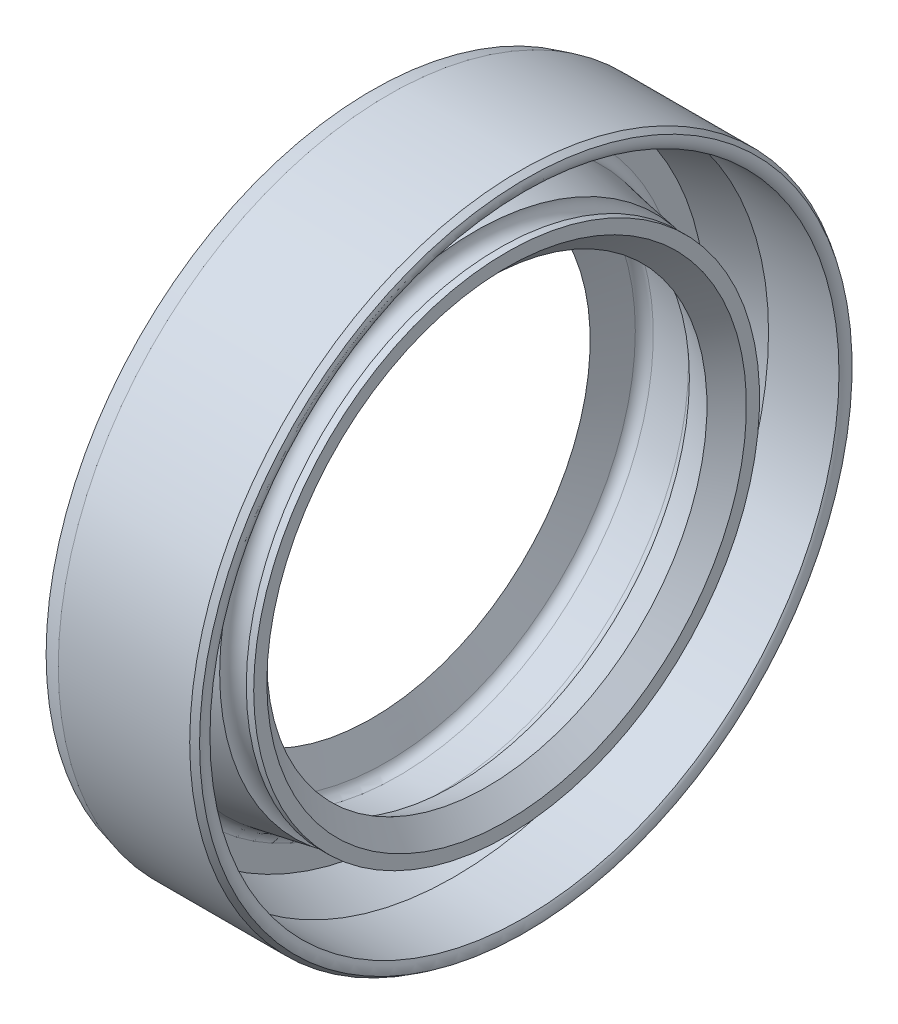
ISO-10303-21;
HEADER;
FILE_DESCRIPTION(('STEP AP214'),'2;1');
FILE_NAME('part.step','',(''),(''),'','','');
FILE_SCHEMA(('AUTOMOTIVE_DESIGN { 1 0 10303 214 1 1 1 1 }'));
ENDSEC;
DATA;
#1=APPLICATION_CONTEXT('core data for automotive mechanical design processes');
#2=APPLICATION_PROTOCOL_DEFINITION('international standard','automotive_design',2000,#1);
#3=PRODUCT_CONTEXT('',#1,'mechanical');
#4=PRODUCT('Part','Part','',(#3));
#5=PRODUCT_RELATED_PRODUCT_CATEGORY('part','',(#4));
#6=PRODUCT_DEFINITION_FORMATION('','',#4);
#7=PRODUCT_DEFINITION_CONTEXT('part definition',#1,'design');
#8=PRODUCT_DEFINITION('design','',#6,#7);
#9=PRODUCT_DEFINITION_SHAPE('','',#8);
#10=(LENGTH_UNIT() NAMED_UNIT(*) SI_UNIT(.MILLI.,.METRE.));
#11=(NAMED_UNIT(*) PLANE_ANGLE_UNIT() SI_UNIT($,.RADIAN.));
#12=(NAMED_UNIT(*) SI_UNIT($,.STERADIAN.) SOLID_ANGLE_UNIT());
#13=UNCERTAINTY_MEASURE_WITH_UNIT(LENGTH_MEASURE(1.E-05),#10,'distance_accuracy_value','');
#14=(GEOMETRIC_REPRESENTATION_CONTEXT(3) GLOBAL_UNCERTAINTY_ASSIGNED_CONTEXT((#13)) GLOBAL_UNIT_ASSIGNED_CONTEXT((#10,
#11,#12)) REPRESENTATION_CONTEXT('',''));
#15=CARTESIAN_POINT('',(0.,0.,0.));
#16=DIRECTION('',(0.,0.,1.));
#17=DIRECTION('',(1.,0.,0.));
#18=AXIS2_PLACEMENT_3D('',#15,#16,#17);
#19=CARTESIAN_POINT('',(-19.4565940720075,0.,0.));
#20=DIRECTION('',(-1.,0.,0.));
#21=DIRECTION('',(0.,0.,1.));
#22=AXIS2_PLACEMENT_3D('',#19,#20,#21);
#23=CYLINDRICAL_SURFACE('',#22,15.);
#24=CARTESIAN_POINT('',(0.752354754295494,0.,0.));
#25=DIRECTION('',(-1.,0.,0.));
#26=DIRECTION('',(0.,0.,1.));
#27=AXIS2_PLACEMENT_3D('',#24,#25,#26);
#28=CIRCLE('',#27,15.);
#29=CARTESIAN_POINT('',(0.752354754295494,0.,15.));
#30=VERTEX_POINT('',#29);
#31=EDGE_CURVE('E93',#30,#30,#28,.T.);
#32=ORIENTED_EDGE('',*,*,#31,.F.);
#33=EDGE_LOOP('',(#32));
#34=FACE_BOUND('',#33,.T.);
#35=CARTESIAN_POINT('',(6.72553980767342,0.,0.));
#36=DIRECTION('',(-1.,0.,0.));
#37=DIRECTION('',(0.,0.,1.));
#38=AXIS2_PLACEMENT_3D('',#35,#36,#37);
#39=CIRCLE('',#38,15.);
#40=CARTESIAN_POINT('',(6.72553980767342,0.,15.));
#41=VERTEX_POINT('',#40);
#42=EDGE_CURVE('E10',#41,#41,#39,.T.);
#43=ORIENTED_EDGE('',*,*,#42,.T.);
#44=EDGE_LOOP('',(#43));
#45=FACE_BOUND('',#44,.T.);
#46=ADVANCED_FACE('F32',(#34,#45),#23,.T.);
#47=CARTESIAN_POINT('',(7.00000000000006,0.,0.));
#48=DIRECTION('',(-1.,0.,0.));
#49=DIRECTION('',(0.,0.,1.));
#50=AXIS2_PLACEMENT_3D('',#47,#48,#49);
#51=CONICAL_SURFACE('',#50,14.826667112104,0.563289195696339);
#52=ORIENTED_EDGE('',*,*,#42,.F.);
#53=EDGE_LOOP('',(#52));
#54=FACE_BOUND('',#53,.T.);
#55=CARTESIAN_POINT('',(7.00000000000006,0.,0.));
#56=DIRECTION('',(-1.,0.,0.));
#57=DIRECTION('',(0.,0.,1.));
#58=AXIS2_PLACEMENT_3D('',#55,#56,#57);
#59=CIRCLE('',#58,14.826667112104);
#60=CARTESIAN_POINT('',(7.00000000000006,0.,14.826667112104));
#61=VERTEX_POINT('',#60);
#62=EDGE_CURVE('E38',#61,#61,#59,.T.);
#63=ORIENTED_EDGE('',*,*,#62,.T.);
#64=EDGE_LOOP('',(#63));
#65=FACE_BOUND('',#64,.T.);
#66=ADVANCED_FACE('F100',(#54,#65),#51,.T.);
#67=CARTESIAN_POINT('',(6.51124728889201,0.,0.));
#68=DIRECTION('',(-1.,0.,0.));
#69=DIRECTION('',(0.,0.,1.));
#70=AXIS2_PLACEMENT_3D('',#67,#68,#69);
#71=TOROIDAL_SURFACE('',#70,14.6121108174778,0.533773000609059);
#72=ORIENTED_EDGE('',*,*,#62,.F.);
#73=EDGE_LOOP('',(#72));
#74=FACE_BOUND('',#73,.T.);
#75=CARTESIAN_POINT('',(6.93904900791708,0.,0.));
#76=DIRECTION('',(-1.,0.,0.));
#77=DIRECTION('',(0.,0.,1.));
#78=AXIS2_PLACEMENT_3D('',#75,#76,#77);
#79=CIRCLE('',#78,14.2928941114951);
#80=CARTESIAN_POINT('',(6.93904900791708,0.,14.2928941114951));
#81=VERTEX_POINT('',#80);
#82=EDGE_CURVE('E42',#81,#81,#79,.T.);
#83=ORIENTED_EDGE('',*,*,#82,.T.);
#84=EDGE_LOOP('',(#83));
#85=FACE_BOUND('',#84,.T.);
#86=ADVANCED_FACE('F104',(#74,#85),#71,.T.);
#87=CARTESIAN_POINT('',(-19.4565940720075,0.,0.));
#88=DIRECTION('',(-1.,0.,0.));
#89=DIRECTION('',(0.,0.,1.));
#90=AXIS2_PLACEMENT_3D('',#87,#88,#89);
#91=CYLINDRICAL_SURFACE('',#90,14.2928941114951);
#92=ORIENTED_EDGE('',*,*,#82,.F.);
#93=EDGE_LOOP('',(#92));
#94=FACE_BOUND('',#93,.T.);
#95=CARTESIAN_POINT('',(3.73641100426317,0.,0.));
#96=DIRECTION('',(-1.,0.,0.));
#97=DIRECTION('',(0.,0.,1.));
#98=AXIS2_PLACEMENT_3D('',#95,#96,#97);
#99=CIRCLE('',#98,14.2928941114952);
#100=CARTESIAN_POINT('',(3.73641100426317,0.,14.2928941114952));
#101=VERTEX_POINT('',#100);
#102=EDGE_CURVE('E46',#101,#101,#99,.T.);
#103=ORIENTED_EDGE('',*,*,#102,.T.);
#104=EDGE_LOOP('',(#103));
#105=FACE_BOUND('',#104,.T.);
#106=ADVANCED_FACE('F109',(#94,#105),#91,.F.);
#107=CARTESIAN_POINT('',(1.4945644017053,0.,0.));
#108=DIRECTION('',(1.,0.,0.));
#109=DIRECTION('',(0.,0.,-1.));
#110=AXIS2_PLACEMENT_3D('',#107,#108,#109);
#111=CONICAL_SURFACE('',#110,13.6921931247855,0.261799387799076);
#112=ORIENTED_EDGE('',*,*,#102,.F.);
#113=EDGE_LOOP('',(#112));
#114=FACE_BOUND('',#113,.T.);
#115=CARTESIAN_POINT('',(1.4945644017053,0.,0.));
#116=DIRECTION('',(-1.,0.,0.));
#117=DIRECTION('',(0.,0.,1.));
#118=AXIS2_PLACEMENT_3D('',#115,#116,#117);
#119=CIRCLE('',#118,13.6921931247855);
#120=CARTESIAN_POINT('',(1.4945644017053,0.,13.6921931247855));
#121=VERTEX_POINT('',#120);
#122=EDGE_CURVE('E51',#121,#121,#119,.T.);
#123=ORIENTED_EDGE('',*,*,#122,.T.);
#124=EDGE_LOOP('',(#123));
#125=FACE_BOUND('',#124,.T.);
#126=ADVANCED_FACE('F115',(#114,#125),#111,.F.);
#127=CARTESIAN_POINT('',(1.49456440170531,0.,-13.6921931247855));
#128=DIRECTION('',(-1.,0.,0.));
#129=DIRECTION('',(0.,0.,1.));
#130=AXIS2_PLACEMENT_3D('',#127,#128,#129);
#131=PLANE('',#130);
#132=ORIENTED_EDGE('',*,*,#122,.F.);
#133=EDGE_LOOP('',(#132));
#134=FACE_BOUND('',#133,.T.);
#135=CARTESIAN_POINT('',(1.49456440170533,0.,0.));
#136=DIRECTION('',(-1.,0.,0.));
#137=DIRECTION('',(0.,0.,1.));
#138=AXIS2_PLACEMENT_3D('',#135,#136,#137);
#139=CIRCLE('',#138,12.6026423873152);
#140=CARTESIAN_POINT('',(1.49456440170533,0.,12.6026423873152));
#141=VERTEX_POINT('',#140);
#142=EDGE_CURVE('E54',#141,#141,#139,.T.);
#143=ORIENTED_EDGE('',*,*,#142,.T.);
#144=EDGE_LOOP('',(#143));
#145=FACE_BOUND('',#144,.T.);
#146=ADVANCED_FACE('F119',(#134,#145),#131,.F.);
#147=CARTESIAN_POINT('',(2.02833740231413,0.,0.));
#148=DIRECTION('',(-1.,0.,0.));
#149=DIRECTION('',(0.,0.,1.));
#150=AXIS2_PLACEMENT_3D('',#147,#148,#149);
#151=TOROIDAL_SURFACE('',#150,12.6026423873148,0.5337730006088);
#152=ORIENTED_EDGE('',*,*,#142,.F.);
#153=EDGE_LOOP('',(#152));
#154=FACE_BOUND('',#153,.T.);
#155=CARTESIAN_POINT('',(1.93564869347058,0.,0.));
#156=DIRECTION('',(-1.,0.,0.));
#157=DIRECTION('',(0.,0.,1.));
#158=AXIS2_PLACEMENT_3D('',#155,#156,#157);
#159=CIRCLE('',#158,12.0769785979668);
#160=CARTESIAN_POINT('',(1.93564869347058,0.,12.0769785979668));
#161=VERTEX_POINT('',#160);
#162=EDGE_CURVE('E57',#161,#161,#159,.T.);
#163=ORIENTED_EDGE('',*,*,#162,.T.);
#164=EDGE_LOOP('',(#163));
#165=FACE_BOUND('',#164,.T.);
#166=ADVANCED_FACE('F123',(#154,#165),#151,.F.);
#167=CARTESIAN_POINT('',(4.67926243586789,0.,0.));
#168=DIRECTION('',(-1.,0.,0.));
#169=DIRECTION('',(0.,0.,1.));
#170=AXIS2_PLACEMENT_3D('',#167,#168,#169);
#171=CONICAL_SURFACE('',#170,11.5932054705393,0.17453292519955);
#172=ORIENTED_EDGE('',*,*,#162,.F.);
#173=EDGE_LOOP('',(#172));
#174=FACE_BOUND('',#173,.T.);
#175=CARTESIAN_POINT('',(4.67926243586789,0.,0.));
#176=DIRECTION('',(-1.,0.,0.));
#177=DIRECTION('',(0.,0.,1.));
#178=AXIS2_PLACEMENT_3D('',#175,#176,#177);
#179=CIRCLE('',#178,11.5932054705393);
#180=CARTESIAN_POINT('',(4.67926243586789,0.,11.5932054705393));
#181=VERTEX_POINT('',#180);
#182=EDGE_CURVE('E60',#181,#181,#179,.T.);
#183=ORIENTED_EDGE('',*,*,#182,.T.);
#184=EDGE_LOOP('',(#183));
#185=FACE_BOUND('',#184,.T.);
#186=ADVANCED_FACE('F127',(#174,#185),#171,.T.);
#187=CARTESIAN_POINT('',(5.23088228864806,0.,0.));
#188=DIRECTION('',(-1.,0.,0.));
#189=DIRECTION('',(0.,0.,1.));
#190=AXIS2_PLACEMENT_3D('',#187,#188,#189);
#191=TOROIDAL_SURFACE('',#190,11.4935145071604,0.56055575116185);
#192=ORIENTED_EDGE('',*,*,#182,.F.);
#193=EDGE_LOOP('',(#192));
#194=FACE_BOUND('',#193,.T.);
#195=CARTESIAN_POINT('',(5.7914370566075,0.,0.));
#196=DIRECTION('',(-1.,0.,0.));
#197=DIRECTION('',(0.,0.,1.));
#198=AXIS2_PLACEMENT_3D('',#195,#196,#197);
#199=CIRCLE('',#198,11.494564401705);
#200=CARTESIAN_POINT('',(5.7914370566075,0.,11.494564401705));
#201=VERTEX_POINT('',#200);
#202=EDGE_CURVE('E63',#201,#201,#199,.T.);
#203=ORIENTED_EDGE('',*,*,#202,.T.);
#204=EDGE_LOOP('',(#203));
#205=FACE_BOUND('',#204,.T.);
#206=ADVANCED_FACE('F131',(#194,#205),#191,.F.);
#207=CARTESIAN_POINT('',(-19.4565940720075,0.,0.));
#208=DIRECTION('',(-1.,0.,0.));
#209=DIRECTION('',(0.,0.,1.));
#210=AXIS2_PLACEMENT_3D('',#207,#208,#209);
#211=CYLINDRICAL_SURFACE('',#210,11.494564401705);
#212=ORIENTED_EDGE('',*,*,#202,.F.);
#213=EDGE_LOOP('',(#212));
#214=FACE_BOUND('',#213,.T.);
#215=CARTESIAN_POINT('',(6.1277140469912,0.,0.));
#216=DIRECTION('',(-1.,0.,0.));
#217=DIRECTION('',(0.,0.,1.));
#218=AXIS2_PLACEMENT_3D('',#215,#216,#217);
#219=CIRCLE('',#218,11.494564401705);
#220=CARTESIAN_POINT('',(6.1277140469912,0.,11.494564401705));
#221=VERTEX_POINT('',#220);
#222=EDGE_CURVE('E66',#221,#221,#219,.T.);
#223=ORIENTED_EDGE('',*,*,#222,.T.);
#224=EDGE_LOOP('',(#223));
#225=FACE_BOUND('',#224,.T.);
#226=ADVANCED_FACE('F135',(#214,#225),#211,.T.);
#227=CARTESIAN_POINT('',(6.1277140469912,0.,-10.8967386410231));
#228=DIRECTION('',(-1.,0.,0.));
#229=DIRECTION('',(0.,0.,1.));
#230=AXIS2_PLACEMENT_3D('',#227,#228,#229);
#231=PLANE('',#230);
#232=ORIENTED_EDGE('',*,*,#222,.F.);
#233=EDGE_LOOP('',(#232));
#234=FACE_BOUND('',#233,.T.);
#235=CARTESIAN_POINT('',(6.1277140469912,0.,0.));
#236=DIRECTION('',(-1.,0.,0.));
#237=DIRECTION('',(0.,0.,1.));
#238=AXIS2_PLACEMENT_3D('',#235,#236,#237);
#239=CIRCLE('',#238,10.8967386410231);
#240=CARTESIAN_POINT('',(6.1277140469912,0.,10.8967386410231));
#241=VERTEX_POINT('',#240);
#242=EDGE_CURVE('E69',#241,#241,#239,.T.);
#243=ORIENTED_EDGE('',*,*,#242,.T.);
#244=EDGE_LOOP('',(#243));
#245=FACE_BOUND('',#244,.T.);
#246=ADVANCED_FACE('F139',(#234,#245),#231,.F.);
#247=CARTESIAN_POINT('',(5.23097540596805,0.,0.));
#248=DIRECTION('',(1.,0.,0.));
#249=DIRECTION('',(0.,0.,-1.));
#250=AXIS2_PLACEMENT_3D('',#247,#248,#249);
#251=CONICAL_SURFACE('',#250,10.,0.785398163397414);
#252=ORIENTED_EDGE('',*,*,#242,.F.);
#253=EDGE_LOOP('',(#252));
#254=FACE_BOUND('',#253,.T.);
#255=CARTESIAN_POINT('',(5.23097540596805,0.,0.));
#256=DIRECTION('',(-1.,0.,0.));
#257=DIRECTION('',(0.,0.,1.));
#258=AXIS2_PLACEMENT_3D('',#255,#256,#257);
#259=CIRCLE('',#258,10.);
#260=CARTESIAN_POINT('',(5.23097540596805,0.,10.));
#261=VERTEX_POINT('',#260);
#262=EDGE_CURVE('E72',#261,#261,#259,.T.);
#263=ORIENTED_EDGE('',*,*,#262,.T.);
#264=EDGE_LOOP('',(#263));
#265=FACE_BOUND('',#264,.T.);
#266=ADVANCED_FACE('F143',(#254,#265),#251,.F.);
#267=CARTESIAN_POINT('',(3.73641100426286,0.,0.));
#268=DIRECTION('',(-1.,0.,0.));
#269=DIRECTION('',(0.,0.,1.));
#270=AXIS2_PLACEMENT_3D('',#267,#268,#269);
#271=CONICAL_SURFACE('',#270,10.696926826121,0.436332312998609);
#272=ORIENTED_EDGE('',*,*,#262,.F.);
#273=EDGE_LOOP('',(#272));
#274=FACE_BOUND('',#273,.T.);
#275=CARTESIAN_POINT('',(3.73641100426286,0.,0.));
#276=DIRECTION('',(-1.,0.,0.));
#277=DIRECTION('',(0.,0.,1.));
#278=AXIS2_PLACEMENT_3D('',#275,#276,#277);
#279=CIRCLE('',#278,10.696926826121);
#280=CARTESIAN_POINT('',(3.73641100426286,0.,10.696926826121));
#281=VERTEX_POINT('',#280);
#282=EDGE_CURVE('E75',#281,#281,#279,.T.);
#283=ORIENTED_EDGE('',*,*,#282,.T.);
#284=EDGE_LOOP('',(#283));
#285=FACE_BOUND('',#284,.T.);
#286=ADVANCED_FACE('F147',(#274,#285),#271,.F.);
#287=CARTESIAN_POINT('',(3.01154726943575,0.,0.));
#288=DIRECTION('',(-1.,0.,0.));
#289=DIRECTION('',(0.,0.,1.));
#290=AXIS2_PLACEMENT_3D('',#287,#288,#289);
#291=TOROIDAL_SURFACE('',#290,10.5152588497367,0.747282200852594);
#292=ORIENTED_EDGE('',*,*,#282,.F.);
#293=EDGE_LOOP('',(#292));
#294=FACE_BOUND('',#293,.T.);
#295=CARTESIAN_POINT('',(3.14131146181692,0.,0.));
#296=DIRECTION('',(-1.,0.,0.));
#297=DIRECTION('',(0.,0.,1.));
#298=AXIS2_PLACEMENT_3D('',#295,#296,#297);
#299=CIRCLE('',#298,11.2511881548243);
#300=CARTESIAN_POINT('',(3.14131146181692,0.,11.2511881548243));
#301=VERTEX_POINT('',#300);
#302=EDGE_CURVE('E78',#301,#301,#299,.T.);
#303=ORIENTED_EDGE('',*,*,#302,.T.);
#304=EDGE_LOOP('',(#303));
#305=FACE_BOUND('',#304,.T.);
#306=ADVANCED_FACE('F151',(#294,#305),#291,.F.);
#307=CARTESIAN_POINT('',(1.19845300871272,0.,0.));
#308=DIRECTION('',(-1.,0.,0.));
#309=DIRECTION('',(0.,0.,1.));
#310=AXIS2_PLACEMENT_3D('',#307,#308,#309);
#311=CONICAL_SURFACE('',#310,11.5937665198039,0.17453292519935);
#312=ORIENTED_EDGE('',*,*,#302,.F.);
#313=EDGE_LOOP('',(#312));
#314=FACE_BOUND('',#313,.T.);
#315=CARTESIAN_POINT('',(1.19845300871272,0.,0.));
#316=DIRECTION('',(-1.,0.,0.));
#317=DIRECTION('',(0.,0.,1.));
#318=AXIS2_PLACEMENT_3D('',#315,#316,#317);
#319=CIRCLE('',#318,11.5937665198039);
#320=CARTESIAN_POINT('',(1.19845300871272,0.,11.5937665198039));
#321=VERTEX_POINT('',#320);
#322=EDGE_CURVE('E81',#321,#321,#319,.T.);
#323=ORIENTED_EDGE('',*,*,#322,.T.);
#324=EDGE_LOOP('',(#323));
#325=FACE_BOUND('',#324,.T.);
#326=ADVANCED_FACE('F155',(#314,#325),#311,.F.);
#327=CARTESIAN_POINT('',(1.1116289198793,0.,0.));
#328=DIRECTION('',(-1.,0.,0.));
#329=DIRECTION('',(0.,0.,1.));
#330=AXIS2_PLACEMENT_3D('',#327,#328,#329);
#331=TOROIDAL_SURFACE('',#330,11.1013626432978,0.5);
#332=ORIENTED_EDGE('',*,*,#322,.F.);
#333=EDGE_LOOP('',(#332));
#334=FACE_BOUND('',#333,.T.);
#335=CARTESIAN_POINT('',(0.659888848220738,0.,0.));
#336=DIRECTION('',(-1.,0.,0.));
#337=DIRECTION('',(0.,0.,1.));
#338=AXIS2_PLACEMENT_3D('',#335,#336,#337);
#339=CIRCLE('',#338,11.3156776163116);
#340=CARTESIAN_POINT('',(0.659888848220738,0.,11.3156776163116));
#341=VERTEX_POINT('',#340);
#342=EDGE_CURVE('E84',#341,#341,#339,.T.);
#343=ORIENTED_EDGE('',*,*,#342,.T.);
#344=EDGE_LOOP('',(#343));
#345=FACE_BOUND('',#344,.T.);
#346=ADVANCED_FACE('F159',(#334,#345),#331,.F.);
#347=CARTESIAN_POINT('',(0.,0.,0.));
#348=DIRECTION('',(1.,0.,0.));
#349=DIRECTION('',(0.,0.,-1.));
#350=AXIS2_PLACEMENT_3D('',#347,#348,#349);
#351=CONICAL_SURFACE('',#350,9.92474243623592,1.1278205147707);
#352=ORIENTED_EDGE('',*,*,#342,.F.);
#353=EDGE_LOOP('',(#352));
#354=FACE_BOUND('',#353,.T.);
#355=CARTESIAN_POINT('',(0.,0.,0.));
#356=DIRECTION('',(-1.,0.,0.));
#357=DIRECTION('',(0.,0.,1.));
#358=AXIS2_PLACEMENT_3D('',#355,#356,#357);
#359=CIRCLE('',#358,9.92474243623592);
#360=CARTESIAN_POINT('',(0.,0.,9.92474243623592));
#361=VERTEX_POINT('',#360);
#362=EDGE_CURVE('E87',#361,#361,#359,.T.);
#363=ORIENTED_EDGE('',*,*,#362,.T.);
#364=EDGE_LOOP('',(#363));
#365=FACE_BOUND('',#364,.T.);
#366=ADVANCED_FACE('F163',(#354,#365),#351,.F.);
#367=CARTESIAN_POINT('',(0.,0.,-14.7997663377634));
#368=DIRECTION('',(1.,0.,0.));
#369=DIRECTION('',(0.,0.,-1.));
#370=AXIS2_PLACEMENT_3D('',#367,#368,#369);
#371=PLANE('',#370);
#372=ORIENTED_EDGE('',*,*,#362,.F.);
#373=EDGE_LOOP('',(#372));
#374=FACE_BOUND('',#373,.T.);
#375=CARTESIAN_POINT('',(0.,0.,0.));
#376=DIRECTION('',(-1.,0.,0.));
#377=DIRECTION('',(0.,0.,1.));
#378=AXIS2_PLACEMENT_3D('',#375,#376,#377);
#379=CIRCLE('',#378,14.7997663377634);
#380=CARTESIAN_POINT('',(0.,0.,14.7997663377634));
#381=VERTEX_POINT('',#380);
#382=EDGE_CURVE('E90',#381,#381,#379,.T.);
#383=ORIENTED_EDGE('',*,*,#382,.T.);
#384=EDGE_LOOP('',(#383));
#385=FACE_BOUND('',#384,.T.);
#386=ADVANCED_FACE('F167',(#374,#385),#371,.F.);
#387=CARTESIAN_POINT('',(0.752354754295494,0.,0.));
#388=DIRECTION('',(1.,0.,0.));
#389=DIRECTION('',(0.,0.,-1.));
#390=AXIS2_PLACEMENT_3D('',#387,#388,#389);
#391=CONICAL_SURFACE('',#390,15.,0.260113068736245);
#392=ORIENTED_EDGE('',*,*,#382,.F.);
#393=EDGE_LOOP('',(#392));
#394=FACE_BOUND('',#393,.T.);
#395=ORIENTED_EDGE('',*,*,#31,.T.);
#396=EDGE_LOOP('',(#395));
#397=FACE_BOUND('',#396,.T.);
#398=ADVANCED_FACE('F97',(#394,#397),#391,.T.);
#399=CLOSED_SHELL('',(#46,#66,#86,#106,#126,#146,#166,#186,#206,#226,#246,#266,#286,#306,#326,
#346,#366,#386,#398));
#400=MANIFOLD_SOLID_BREP('B2',#399);
#401=ADVANCED_BREP_SHAPE_REPRESENTATION('',(#18,#400),#14);
#402=SHAPE_DEFINITION_REPRESENTATION(#9,#401);
ENDSEC;
END-ISO-10303-21;
